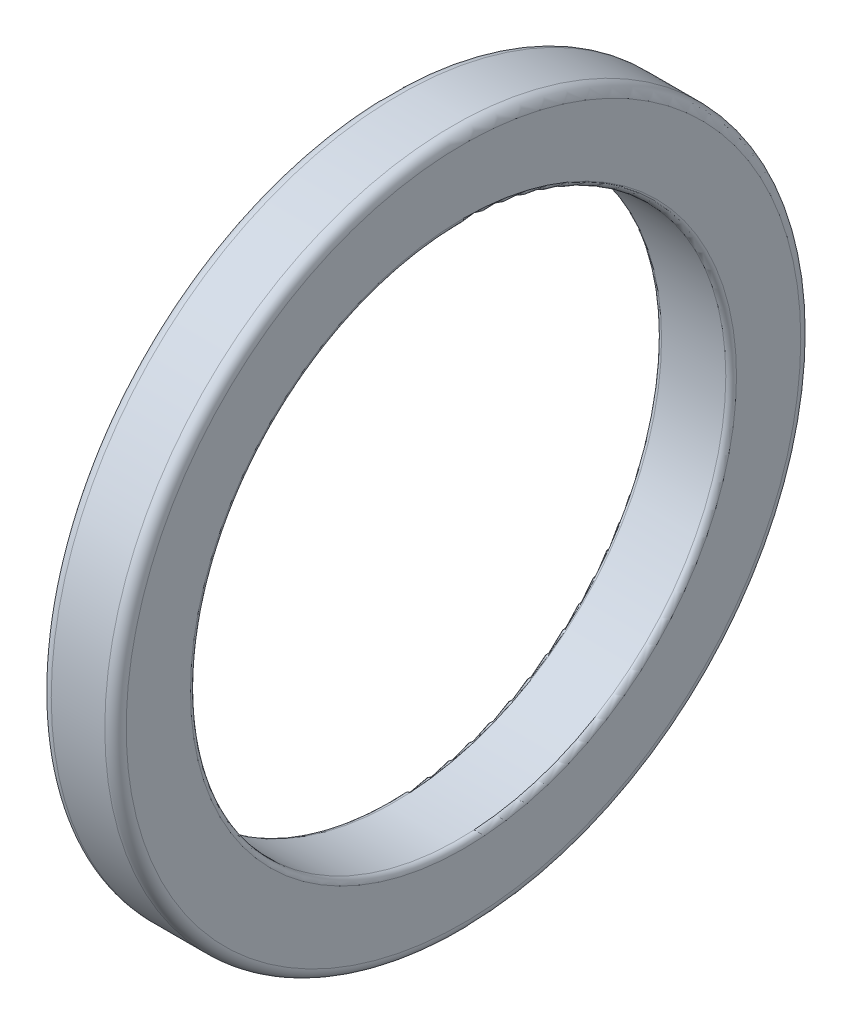
ISO-10303-21;
HEADER;
FILE_DESCRIPTION(('STEP AP214'),'2;1');
FILE_NAME('part.step','',(''),(''),'','','');
FILE_SCHEMA(('AUTOMOTIVE_DESIGN { 1 0 10303 214 1 1 1 1 }'));
ENDSEC;
DATA;
#1=APPLICATION_CONTEXT('core data for automotive mechanical design processes');
#2=APPLICATION_PROTOCOL_DEFINITION('international standard','automotive_design',2000,#1);
#3=PRODUCT_CONTEXT('',#1,'mechanical');
#4=PRODUCT('Part','Part','',(#3));
#5=PRODUCT_RELATED_PRODUCT_CATEGORY('part','',(#4));
#6=PRODUCT_DEFINITION_FORMATION('','',#4);
#7=PRODUCT_DEFINITION_CONTEXT('part definition',#1,'design');
#8=PRODUCT_DEFINITION('design','',#6,#7);
#9=PRODUCT_DEFINITION_SHAPE('','',#8);
#10=(LENGTH_UNIT() NAMED_UNIT(*) SI_UNIT(.MILLI.,.METRE.));
#11=(NAMED_UNIT(*) PLANE_ANGLE_UNIT() SI_UNIT($,.RADIAN.));
#12=(NAMED_UNIT(*) SI_UNIT($,.STERADIAN.) SOLID_ANGLE_UNIT());
#13=UNCERTAINTY_MEASURE_WITH_UNIT(LENGTH_MEASURE(1.E-05),#10,'distance_accuracy_value','');
#14=(GEOMETRIC_REPRESENTATION_CONTEXT(3) GLOBAL_UNCERTAINTY_ASSIGNED_CONTEXT((#13)) GLOBAL_UNIT_ASSIGNED_CONTEXT((#10,
#11,#12)) REPRESENTATION_CONTEXT('',''));
#15=CARTESIAN_POINT('',(0.,0.,0.));
#16=DIRECTION('',(0.,0.,1.));
#17=DIRECTION('',(1.,0.,0.));
#18=AXIS2_PLACEMENT_3D('',#15,#16,#17);
#19=CARTESIAN_POINT('',(7.,0.,0.));
#20=DIRECTION('',(1.,0.,0.));
#21=DIRECTION('',(0.,0.,-1.));
#22=AXIS2_PLACEMENT_3D('',#19,#20,#21);
#23=PLANE('',#22);
#24=CARTESIAN_POINT('',(7.,0.,0.));
#25=DIRECTION('',(1.,0.,0.));
#26=DIRECTION('',(0.,0.,-1.));
#27=AXIS2_PLACEMENT_3D('',#24,#25,#26);
#28=CIRCLE('',#27,25.5);
#29=CARTESIAN_POINT('',(7.,0.,-25.5));
#30=VERTEX_POINT('',#29);
#31=EDGE_CURVE('E37',#30,#30,#28,.F.);
#32=ORIENTED_EDGE('',*,*,#31,.T.);
#33=EDGE_LOOP('',(#32));
#34=FACE_BOUND('',#33,.T.);
#35=CARTESIAN_POINT('',(7.,0.,0.));
#36=DIRECTION('',(1.,0.,0.));
#37=DIRECTION('',(0.,0.,-1.));
#38=AXIS2_PLACEMENT_3D('',#35,#36,#37);
#39=CIRCLE('',#38,31.5);
#40=CARTESIAN_POINT('',(7.,0.,-31.5));
#41=VERTEX_POINT('',#40);
#42=EDGE_CURVE('E50',#41,#41,#39,.T.);
#43=ORIENTED_EDGE('',*,*,#42,.T.);
#44=EDGE_LOOP('',(#43));
#45=FACE_BOUND('',#44,.T.);
#46=ADVANCED_FACE('F30',(#34,#45),#23,.T.);
#47=CARTESIAN_POINT('',(0.,0.,0.));
#48=DIRECTION('',(1.,0.,0.));
#49=DIRECTION('',(0.,0.,-1.));
#50=AXIS2_PLACEMENT_3D('',#47,#48,#49);
#51=PLANE('',#50);
#52=CARTESIAN_POINT('',(0.,0.,0.));
#53=DIRECTION('',(1.,0.,0.));
#54=DIRECTION('',(0.,0.,-1.));
#55=AXIS2_PLACEMENT_3D('',#52,#53,#54);
#56=CIRCLE('',#55,25.5);
#57=CARTESIAN_POINT('',(0.,0.,-25.5));
#58=VERTEX_POINT('',#57);
#59=EDGE_CURVE('E10',#58,#58,#56,.T.);
#60=ORIENTED_EDGE('',*,*,#59,.T.);
#61=EDGE_LOOP('',(#60));
#62=FACE_BOUND('',#61,.T.);
#63=CARTESIAN_POINT('',(0.,0.,0.));
#64=DIRECTION('',(1.,0.,0.));
#65=DIRECTION('',(0.,0.,-1.));
#66=AXIS2_PLACEMENT_3D('',#63,#64,#65);
#67=CIRCLE('',#66,31.5);
#68=CARTESIAN_POINT('',(0.,0.,-31.5));
#69=VERTEX_POINT('',#68);
#70=EDGE_CURVE('E53',#69,#69,#67,.F.);
#71=ORIENTED_EDGE('',*,*,#70,.T.);
#72=EDGE_LOOP('',(#71));
#73=FACE_BOUND('',#72,.T.);
#74=ADVANCED_FACE('F74',(#62,#73),#51,.F.);
#75=CARTESIAN_POINT('',(7.,0.,0.));
#76=DIRECTION('',(-1.,0.,0.));
#77=DIRECTION('',(0.,0.,1.));
#78=AXIS2_PLACEMENT_3D('',#75,#76,#77);
#79=CYLINDRICAL_SURFACE('',#78,32.5);
#80=CARTESIAN_POINT('',(1.,0.,0.));
#81=DIRECTION('',(1.,0.,0.));
#82=DIRECTION('',(0.,0.,-1.));
#83=AXIS2_PLACEMENT_3D('',#80,#81,#82);
#84=CIRCLE('',#83,32.5);
#85=CARTESIAN_POINT('',(1.,0.,-32.5));
#86=VERTEX_POINT('',#85);
#87=EDGE_CURVE('E56',#86,#86,#84,.T.);
#88=ORIENTED_EDGE('',*,*,#87,.T.);
#89=EDGE_LOOP('',(#88));
#90=FACE_BOUND('',#89,.T.);
#91=CARTESIAN_POINT('',(6.,0.,0.));
#92=DIRECTION('',(1.,0.,0.));
#93=DIRECTION('',(0.,0.,-1.));
#94=AXIS2_PLACEMENT_3D('',#91,#92,#93);
#95=CIRCLE('',#94,32.5);
#96=CARTESIAN_POINT('',(6.,0.,-32.5));
#97=VERTEX_POINT('',#96);
#98=EDGE_CURVE('E59',#97,#97,#95,.F.);
#99=ORIENTED_EDGE('',*,*,#98,.T.);
#100=EDGE_LOOP('',(#99));
#101=FACE_BOUND('',#100,.T.);
#102=ADVANCED_FACE('F63',(#90,#101),#79,.T.);
#103=CARTESIAN_POINT('',(7.,0.,0.));
#104=DIRECTION('',(-1.,0.,0.));
#105=DIRECTION('',(0.,0.,1.));
#106=AXIS2_PLACEMENT_3D('',#103,#104,#105);
#107=CYLINDRICAL_SURFACE('',#106,25.);
#108=CARTESIAN_POINT('',(6.5,0.,0.));
#109=DIRECTION('',(1.,0.,0.));
#110=DIRECTION('',(0.,0.,-1.));
#111=AXIS2_PLACEMENT_3D('',#108,#109,#110);
#112=CIRCLE('',#111,25.);
#113=CARTESIAN_POINT('',(6.5,0.,-25.));
#114=VERTEX_POINT('',#113);
#115=EDGE_CURVE('E41',#114,#114,#112,.T.);
#116=ORIENTED_EDGE('',*,*,#115,.T.);
#117=EDGE_LOOP('',(#116));
#118=FACE_BOUND('',#117,.T.);
#119=CARTESIAN_POINT('',(0.5,0.,0.));
#120=DIRECTION('',(1.,0.,0.));
#121=DIRECTION('',(0.,0.,-1.));
#122=AXIS2_PLACEMENT_3D('',#119,#120,#121);
#123=CIRCLE('',#122,25.);
#124=CARTESIAN_POINT('',(0.5,0.,-25.));
#125=VERTEX_POINT('',#124);
#126=EDGE_CURVE('E45',#125,#125,#123,.F.);
#127=ORIENTED_EDGE('',*,*,#126,.T.);
#128=EDGE_LOOP('',(#127));
#129=FACE_BOUND('',#128,.T.);
#130=ADVANCED_FACE('F81',(#118,#129),#107,.F.);
#131=CARTESIAN_POINT('',(1.,0.,0.));
#132=DIRECTION('',(1.,0.,0.));
#133=DIRECTION('',(0.,0.,-1.));
#134=AXIS2_PLACEMENT_3D('',#131,#132,#133);
#135=TOROIDAL_SURFACE('',#134,31.5,1.);
#136=ORIENTED_EDGE('',*,*,#70,.F.);
#137=EDGE_LOOP('',(#136));
#138=FACE_BOUND('',#137,.T.);
#139=ORIENTED_EDGE('',*,*,#87,.F.);
#140=EDGE_LOOP('',(#139));
#141=FACE_BOUND('',#140,.T.);
#142=ADVANCED_FACE('F69',(#138,#141),#135,.T.);
#143=CARTESIAN_POINT('',(6.,0.,0.));
#144=DIRECTION('',(1.,0.,0.));
#145=DIRECTION('',(0.,0.,-1.));
#146=AXIS2_PLACEMENT_3D('',#143,#144,#145);
#147=TOROIDAL_SURFACE('',#146,31.5,1.);
#148=ORIENTED_EDGE('',*,*,#98,.F.);
#149=EDGE_LOOP('',(#148));
#150=FACE_BOUND('',#149,.T.);
#151=ORIENTED_EDGE('',*,*,#42,.F.);
#152=EDGE_LOOP('',(#151));
#153=FACE_BOUND('',#152,.T.);
#154=ADVANCED_FACE('F65',(#150,#153),#147,.T.);
#155=CARTESIAN_POINT('',(6.5,0.,0.));
#156=DIRECTION('',(1.,0.,0.));
#157=DIRECTION('',(0.,0.,-1.));
#158=AXIS2_PLACEMENT_3D('',#155,#156,#157);
#159=TOROIDAL_SURFACE('',#158,25.5,0.5);
#160=ORIENTED_EDGE('',*,*,#31,.F.);
#161=EDGE_LOOP('',(#160));
#162=FACE_BOUND('',#161,.T.);
#163=ORIENTED_EDGE('',*,*,#115,.F.);
#164=EDGE_LOOP('',(#163));
#165=FACE_BOUND('',#164,.T.);
#166=ADVANCED_FACE('F68',(#162,#165),#159,.T.);
#167=CARTESIAN_POINT('',(0.5,0.,0.));
#168=DIRECTION('',(1.,0.,0.));
#169=DIRECTION('',(0.,0.,-1.));
#170=AXIS2_PLACEMENT_3D('',#167,#168,#169);
#171=TOROIDAL_SURFACE('',#170,25.5,0.5);
#172=ORIENTED_EDGE('',*,*,#126,.F.);
#173=EDGE_LOOP('',(#172));
#174=FACE_BOUND('',#173,.T.);
#175=ORIENTED_EDGE('',*,*,#59,.F.);
#176=EDGE_LOOP('',(#175));
#177=FACE_BOUND('',#176,.T.);
#178=ADVANCED_FACE('F32',(#174,#177),#171,.T.);
#179=CLOSED_SHELL('',(#46,#74,#102,#130,#142,#154,#166,#178));
#180=MANIFOLD_SOLID_BREP('B2',#179);
#181=ADVANCED_BREP_SHAPE_REPRESENTATION('',(#18,#180),#14);
#182=SHAPE_DEFINITION_REPRESENTATION(#9,#181);
ENDSEC;
END-ISO-10303-21;
